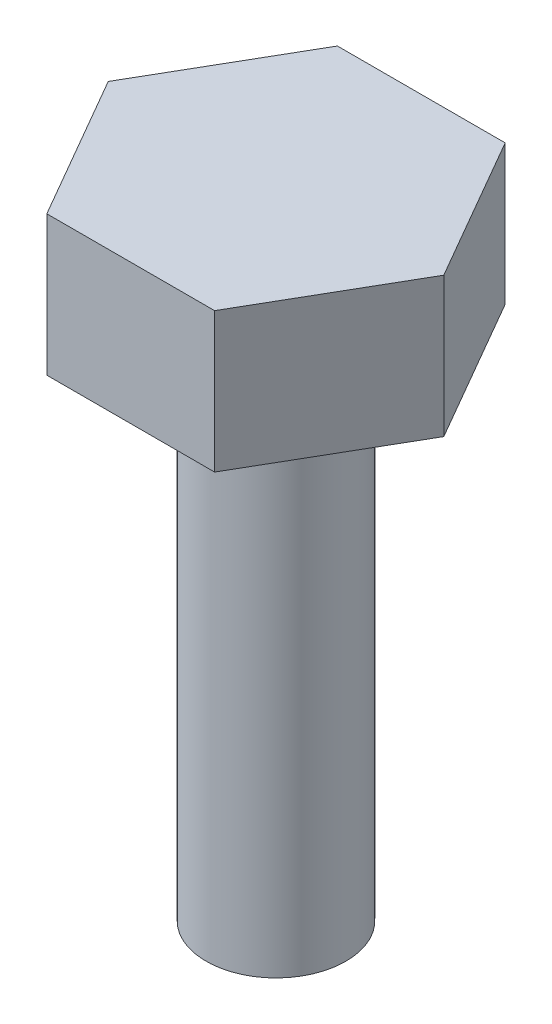
ISO-10303-21;
HEADER;
FILE_DESCRIPTION(('STEP AP214'),'2;1');
FILE_NAME('part.step','',(''),(''),'','','');
FILE_SCHEMA(('AUTOMOTIVE_DESIGN { 1 0 10303 214 1 1 1 1 }'));
ENDSEC;
DATA;
#1=APPLICATION_CONTEXT('core data for automotive mechanical design processes');
#2=APPLICATION_PROTOCOL_DEFINITION('international standard','automotive_design',2000,#1);
#3=PRODUCT_CONTEXT('',#1,'mechanical');
#4=PRODUCT('Part','Part','',(#3));
#5=PRODUCT_RELATED_PRODUCT_CATEGORY('part','',(#4));
#6=PRODUCT_DEFINITION_FORMATION('','',#4);
#7=PRODUCT_DEFINITION_CONTEXT('part definition',#1,'design');
#8=PRODUCT_DEFINITION('design','',#6,#7);
#9=PRODUCT_DEFINITION_SHAPE('','',#8);
#10=(LENGTH_UNIT() NAMED_UNIT(*) SI_UNIT(.MILLI.,.METRE.));
#11=(NAMED_UNIT(*) PLANE_ANGLE_UNIT() SI_UNIT($,.RADIAN.));
#12=(NAMED_UNIT(*) SI_UNIT($,.STERADIAN.) SOLID_ANGLE_UNIT());
#13=UNCERTAINTY_MEASURE_WITH_UNIT(LENGTH_MEASURE(1.E-05),#10,'distance_accuracy_value','');
#14=(GEOMETRIC_REPRESENTATION_CONTEXT(3) GLOBAL_UNCERTAINTY_ASSIGNED_CONTEXT((#13)) GLOBAL_UNIT_ASSIGNED_CONTEXT((#10,
#11,#12)) REPRESENTATION_CONTEXT('',''));
#15=CARTESIAN_POINT('',(0.,0.,0.));
#16=DIRECTION('',(0.,0.,1.));
#17=DIRECTION('',(1.,0.,0.));
#18=AXIS2_PLACEMENT_3D('',#15,#16,#17);
#19=CARTESIAN_POINT('',(7.62,12.7,13.1982271536748));
#20=DIRECTION('',(-0.866025403784439,0.,-0.5));
#21=DIRECTION('',(-0.5,0.,0.866025403784439));
#22=AXIS2_PLACEMENT_3D('',#19,#20,#21);
#23=PLANE('',#22);
#24=DIRECTION('',(0.5,0.,-0.866025403784439));
#25=VECTOR('',#24,1.);
#26=CARTESIAN_POINT('',(7.62,0.,13.1982271536748));
#27=LINE('',#26,#25);
#28=CARTESIAN_POINT('',(7.62,0.,13.1982271536748));
#29=VERTEX_POINT('',#28);
#30=CARTESIAN_POINT('',(15.24,0.,0.));
#31=VERTEX_POINT('',#30);
#32=EDGE_CURVE('E133',#29,#31,#27,.T.);
#33=ORIENTED_EDGE('',*,*,#32,.T.);
#34=DIRECTION('',(0.,-1.,0.));
#35=VECTOR('',#34,1.);
#36=CARTESIAN_POINT('',(15.24,12.7,0.));
#37=LINE('',#36,#35);
#38=CARTESIAN_POINT('',(15.24,12.7,0.));
#39=VERTEX_POINT('',#38);
#40=EDGE_CURVE('E45',#39,#31,#37,.T.);
#41=ORIENTED_EDGE('',*,*,#40,.F.);
#42=DIRECTION('',(0.5,0.,-0.866025403784439));
#43=VECTOR('',#42,1.);
#44=CARTESIAN_POINT('',(7.62,12.7,13.1982271536748));
#45=LINE('',#44,#43);
#46=CARTESIAN_POINT('',(7.62,12.7,13.1982271536748));
#47=VERTEX_POINT('',#46);
#48=EDGE_CURVE('E150',#47,#39,#45,.T.);
#49=ORIENTED_EDGE('',*,*,#48,.F.);
#50=DIRECTION('',(0.,-1.,0.));
#51=VECTOR('',#50,1.);
#52=CARTESIAN_POINT('',(7.62,12.7,13.1982271536748));
#53=LINE('',#52,#51);
#54=EDGE_CURVE('E129',#47,#29,#53,.T.);
#55=ORIENTED_EDGE('',*,*,#54,.T.);
#56=EDGE_LOOP('',(#33,#41,#49,#55));
#57=FACE_BOUND('',#56,.T.);
#58=ADVANCED_FACE('F42',(#57),#23,.F.);
#59=CARTESIAN_POINT('',(15.24,12.7,0.));
#60=DIRECTION('',(-0.866025403784438,0.,0.5));
#61=DIRECTION('',(0.5,0.,0.866025403784439));
#62=AXIS2_PLACEMENT_3D('',#59,#60,#61);
#63=PLANE('',#62);
#64=DIRECTION('',(-0.5,0.,-0.866025403784439));
#65=VECTOR('',#64,1.);
#66=CARTESIAN_POINT('',(15.24,0.,0.));
#67=LINE('',#66,#65);
#68=CARTESIAN_POINT('',(7.61999999999999,0.,-13.1982271536748));
#69=VERTEX_POINT('',#68);
#70=EDGE_CURVE('E137',#31,#69,#67,.T.);
#71=ORIENTED_EDGE('',*,*,#70,.T.);
#72=DIRECTION('',(0.,-1.,0.));
#73=VECTOR('',#72,1.);
#74=CARTESIAN_POINT('',(7.61999999999999,12.7,-13.1982271536748));
#75=LINE('',#74,#73);
#76=CARTESIAN_POINT('',(7.61999999999999,12.7,-13.1982271536748));
#77=VERTEX_POINT('',#76);
#78=EDGE_CURVE('E156',#77,#69,#75,.T.);
#79=ORIENTED_EDGE('',*,*,#78,.F.);
#80=DIRECTION('',(-0.5,0.,-0.866025403784439));
#81=VECTOR('',#80,1.);
#82=CARTESIAN_POINT('',(15.24,12.7,0.));
#83=LINE('',#82,#81);
#84=EDGE_CURVE('E98',#39,#77,#83,.T.);
#85=ORIENTED_EDGE('',*,*,#84,.F.);
#86=ORIENTED_EDGE('',*,*,#40,.T.);
#87=EDGE_LOOP('',(#71,#79,#85,#86));
#88=FACE_BOUND('',#87,.T.);
#89=ADVANCED_FACE('F163',(#88),#63,.F.);
#90=CARTESIAN_POINT('',(7.61999999999999,12.7,-13.1982271536748));
#91=DIRECTION('',(0.,0.,1.));
#92=DIRECTION('',(1.,0.,0.));
#93=AXIS2_PLACEMENT_3D('',#90,#91,#92);
#94=PLANE('',#93);
#95=DIRECTION('',(-1.,0.,0.));
#96=VECTOR('',#95,1.);
#97=CARTESIAN_POINT('',(7.61999999999999,0.,-13.1982271536748));
#98=LINE('',#97,#96);
#99=CARTESIAN_POINT('',(-7.62,0.,-13.1982271536748));
#100=VERTEX_POINT('',#99);
#101=EDGE_CURVE('E141',#69,#100,#98,.T.);
#102=ORIENTED_EDGE('',*,*,#101,.T.);
#103=DIRECTION('',(0.,-1.,0.));
#104=VECTOR('',#103,1.);
#105=CARTESIAN_POINT('',(-7.62,12.7,-13.1982271536748));
#106=LINE('',#105,#104);
#107=CARTESIAN_POINT('',(-7.62,12.7,-13.1982271536748));
#108=VERTEX_POINT('',#107);
#109=EDGE_CURVE('E122',#108,#100,#106,.T.);
#110=ORIENTED_EDGE('',*,*,#109,.F.);
#111=DIRECTION('',(-1.,0.,0.));
#112=VECTOR('',#111,1.);
#113=CARTESIAN_POINT('',(7.61999999999999,12.7,-13.1982271536748));
#114=LINE('',#113,#112);
#115=EDGE_CURVE('E111',#77,#108,#114,.T.);
#116=ORIENTED_EDGE('',*,*,#115,.F.);
#117=ORIENTED_EDGE('',*,*,#78,.T.);
#118=EDGE_LOOP('',(#102,#110,#116,#117));
#119=FACE_BOUND('',#118,.T.);
#120=ADVANCED_FACE('F169',(#119),#94,.F.);
#121=CARTESIAN_POINT('',(-7.62,12.7,-13.1982271536748));
#122=DIRECTION('',(0.866025403784439,0.,0.5));
#123=DIRECTION('',(0.5,0.,-0.866025403784439));
#124=AXIS2_PLACEMENT_3D('',#121,#122,#123);
#125=PLANE('',#124);
#126=DIRECTION('',(-0.5,0.,0.866025403784439));
#127=VECTOR('',#126,1.);
#128=CARTESIAN_POINT('',(-7.62,0.,-13.1982271536748));
#129=LINE('',#128,#127);
#130=CARTESIAN_POINT('',(-15.24,0.,0.));
#131=VERTEX_POINT('',#130);
#132=EDGE_CURVE('E120',#100,#131,#129,.T.);
#133=ORIENTED_EDGE('',*,*,#132,.T.);
#134=DIRECTION('',(0.,-1.,0.));
#135=VECTOR('',#134,1.);
#136=CARTESIAN_POINT('',(-15.24,12.7,0.));
#137=LINE('',#136,#135);
#138=CARTESIAN_POINT('',(-15.24,12.7,0.));
#139=VERTEX_POINT('',#138);
#140=EDGE_CURVE('E117',#139,#131,#137,.T.);
#141=ORIENTED_EDGE('',*,*,#140,.F.);
#142=DIRECTION('',(-0.5,0.,0.866025403784439));
#143=VECTOR('',#142,1.);
#144=CARTESIAN_POINT('',(-7.62,12.7,-13.1982271536748));
#145=LINE('',#144,#143);
#146=EDGE_CURVE('E105',#108,#139,#145,.T.);
#147=ORIENTED_EDGE('',*,*,#146,.F.);
#148=ORIENTED_EDGE('',*,*,#109,.T.);
#149=EDGE_LOOP('',(#133,#141,#147,#148));
#150=FACE_BOUND('',#149,.T.);
#151=ADVANCED_FACE('F118',(#150),#125,.F.);
#152=CARTESIAN_POINT('',(-15.24,12.7,0.));
#153=DIRECTION('',(0.866025403784439,0.,-0.5));
#154=DIRECTION('',(-0.5,0.,-0.866025403784439));
#155=AXIS2_PLACEMENT_3D('',#152,#153,#154);
#156=PLANE('',#155);
#157=DIRECTION('',(0.5,0.,0.866025403784439));
#158=VECTOR('',#157,1.);
#159=CARTESIAN_POINT('',(-15.24,0.,0.));
#160=LINE('',#159,#158);
#161=CARTESIAN_POINT('',(-7.62,0.,13.1982271536748));
#162=VERTEX_POINT('',#161);
#163=EDGE_CURVE('E83',#131,#162,#160,.T.);
#164=ORIENTED_EDGE('',*,*,#163,.T.);
#165=DIRECTION('',(0.,-1.,0.));
#166=VECTOR('',#165,1.);
#167=CARTESIAN_POINT('',(-7.62,12.7,13.1982271536748));
#168=LINE('',#167,#166);
#169=CARTESIAN_POINT('',(-7.62,12.7,13.1982271536748));
#170=VERTEX_POINT('',#169);
#171=EDGE_CURVE('E123',#170,#162,#168,.T.);
#172=ORIENTED_EDGE('',*,*,#171,.F.);
#173=DIRECTION('',(0.5,0.,0.866025403784439));
#174=VECTOR('',#173,1.);
#175=CARTESIAN_POINT('',(-15.24,12.7,0.));
#176=LINE('',#175,#174);
#177=EDGE_CURVE('E109',#139,#170,#176,.T.);
#178=ORIENTED_EDGE('',*,*,#177,.F.);
#179=ORIENTED_EDGE('',*,*,#140,.T.);
#180=EDGE_LOOP('',(#164,#172,#178,#179));
#181=FACE_BOUND('',#180,.T.);
#182=ADVANCED_FACE('F125',(#181),#156,.F.);
#183=CARTESIAN_POINT('',(-7.62,12.7,13.1982271536748));
#184=DIRECTION('',(0.,0.,-1.));
#185=DIRECTION('',(-1.,0.,0.));
#186=AXIS2_PLACEMENT_3D('',#183,#184,#185);
#187=PLANE('',#186);
#188=DIRECTION('',(1.,0.,0.));
#189=VECTOR('',#188,1.);
#190=CARTESIAN_POINT('',(-7.62,0.,13.1982271536748));
#191=LINE('',#190,#189);
#192=EDGE_CURVE('E89',#162,#29,#191,.T.);
#193=ORIENTED_EDGE('',*,*,#192,.T.);
#194=ORIENTED_EDGE('',*,*,#54,.F.);
#195=DIRECTION('',(1.,0.,0.));
#196=VECTOR('',#195,1.);
#197=CARTESIAN_POINT('',(-7.62,12.7,13.1982271536748));
#198=LINE('',#197,#196);
#199=EDGE_CURVE('E60',#170,#47,#198,.T.);
#200=ORIENTED_EDGE('',*,*,#199,.F.);
#201=ORIENTED_EDGE('',*,*,#171,.T.);
#202=EDGE_LOOP('',(#193,#194,#200,#201));
#203=FACE_BOUND('',#202,.T.);
#204=ADVANCED_FACE('F193',(#203),#187,.F.);
#205=CARTESIAN_POINT('',(0.,12.7,0.));
#206=DIRECTION('',(0.,1.,0.));
#207=DIRECTION('',(0.,0.,1.));
#208=AXIS2_PLACEMENT_3D('',#205,#206,#207);
#209=PLANE('',#208);
#210=ORIENTED_EDGE('',*,*,#48,.T.);
#211=ORIENTED_EDGE('',*,*,#84,.T.);
#212=ORIENTED_EDGE('',*,*,#115,.T.);
#213=ORIENTED_EDGE('',*,*,#146,.T.);
#214=ORIENTED_EDGE('',*,*,#177,.T.);
#215=ORIENTED_EDGE('',*,*,#199,.T.);
#216=EDGE_LOOP('',(#210,#211,#212,#213,#214,#215));
#217=FACE_BOUND('',#216,.T.);
#218=ADVANCED_FACE('F107',(#217),#209,.T.);
#219=CARTESIAN_POINT('',(0.,0.,0.));
#220=DIRECTION('',(0.,1.,0.));
#221=DIRECTION('',(0.,0.,1.));
#222=AXIS2_PLACEMENT_3D('',#219,#220,#221);
#223=PLANE('',#222);
#224=CARTESIAN_POINT('',(0.,0.,0.));
#225=DIRECTION('',(0.,-1.,0.));
#226=DIRECTION('',(0.,0.,-1.));
#227=AXIS2_PLACEMENT_3D('',#224,#225,#226);
#228=CIRCLE('',#227,6.35);
#229=CARTESIAN_POINT('',(0.,0.,-6.35));
#230=VERTEX_POINT('',#229);
#231=EDGE_CURVE('E11',#230,#230,#228,.T.);
#232=ORIENTED_EDGE('',*,*,#231,.F.);
#233=EDGE_LOOP('',(#232));
#234=FACE_BOUND('',#233,.T.);
#235=ORIENTED_EDGE('',*,*,#32,.F.);
#236=ORIENTED_EDGE('',*,*,#192,.F.);
#237=ORIENTED_EDGE('',*,*,#163,.F.);
#238=ORIENTED_EDGE('',*,*,#132,.F.);
#239=ORIENTED_EDGE('',*,*,#101,.F.);
#240=ORIENTED_EDGE('',*,*,#70,.F.);
#241=EDGE_LOOP('',(#235,#236,#237,#238,#239,#240));
#242=FACE_BOUND('',#241,.T.);
#243=ADVANCED_FACE('F168',(#234,#242),#223,.F.);
#244=CARTESIAN_POINT('',(0.,-45.72,0.));
#245=DIRECTION('',(0.,1.,0.));
#246=DIRECTION('',(0.,0.,1.));
#247=AXIS2_PLACEMENT_3D('',#244,#245,#246);
#248=CYLINDRICAL_SURFACE('',#247,6.35);
#249=CARTESIAN_POINT('',(0.,-45.72,0.));
#250=DIRECTION('',(0.,-1.,0.));
#251=DIRECTION('',(0.,0.,-1.));
#252=AXIS2_PLACEMENT_3D('',#249,#250,#251);
#253=CIRCLE('',#252,6.35);
#254=CARTESIAN_POINT('',(0.,-45.72,-6.35));
#255=VERTEX_POINT('',#254);
#256=EDGE_CURVE('E138',#255,#255,#253,.T.);
#257=ORIENTED_EDGE('',*,*,#256,.F.);
#258=EDGE_LOOP('',(#257));
#259=FACE_BOUND('',#258,.T.);
#260=ORIENTED_EDGE('',*,*,#231,.T.);
#261=EDGE_LOOP('',(#260));
#262=FACE_BOUND('',#261,.T.);
#263=ADVANCED_FACE('F182',(#259,#262),#248,.T.);
#264=CARTESIAN_POINT('',(0.,-45.72,0.));
#265=DIRECTION('',(0.,-1.,0.));
#266=DIRECTION('',(0.,0.,-1.));
#267=AXIS2_PLACEMENT_3D('',#264,#265,#266);
#268=PLANE('',#267);
#269=ORIENTED_EDGE('',*,*,#256,.T.);
#270=EDGE_LOOP('',(#269));
#271=FACE_BOUND('',#270,.T.);
#272=ADVANCED_FACE('F180',(#271),#268,.T.);
#273=CLOSED_SHELL('',(#58,#89,#120,#151,#182,#204,#218,#243,#263,#272));
#274=MANIFOLD_SOLID_BREP('B2',#273);
#275=ADVANCED_BREP_SHAPE_REPRESENTATION('',(#18,#274),#14);
#276=SHAPE_DEFINITION_REPRESENTATION(#9,#275);
ENDSEC;
END-ISO-10303-21;
